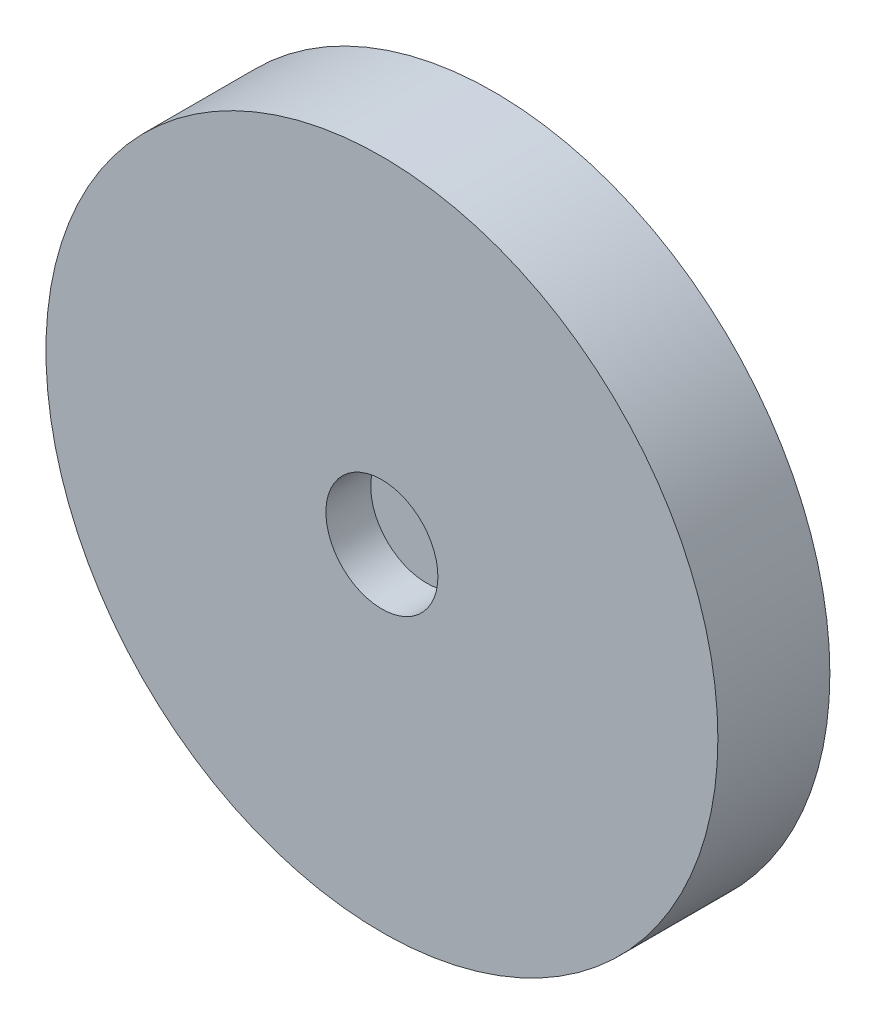
ISO-10303-21;
HEADER;
FILE_DESCRIPTION(('STEP AP214'),'2;1');
FILE_NAME('part.step','',(''),(''),'','','');
FILE_SCHEMA(('AUTOMOTIVE_DESIGN { 1 0 10303 214 1 1 1 1 }'));
ENDSEC;
DATA;
#1=APPLICATION_CONTEXT('core data for automotive mechanical design processes');
#2=APPLICATION_PROTOCOL_DEFINITION('international standard','automotive_design',2000,#1);
#3=PRODUCT_CONTEXT('',#1,'mechanical');
#4=PRODUCT('Part','Part','',(#3));
#5=PRODUCT_RELATED_PRODUCT_CATEGORY('part','',(#4));
#6=PRODUCT_DEFINITION_FORMATION('','',#4);
#7=PRODUCT_DEFINITION_CONTEXT('part definition',#1,'design');
#8=PRODUCT_DEFINITION('design','',#6,#7);
#9=PRODUCT_DEFINITION_SHAPE('','',#8);
#10=(LENGTH_UNIT() NAMED_UNIT(*) SI_UNIT(.MILLI.,.METRE.));
#11=(NAMED_UNIT(*) PLANE_ANGLE_UNIT() SI_UNIT($,.RADIAN.));
#12=(NAMED_UNIT(*) SI_UNIT($,.STERADIAN.) SOLID_ANGLE_UNIT());
#13=UNCERTAINTY_MEASURE_WITH_UNIT(LENGTH_MEASURE(1.E-05),#10,'distance_accuracy_value','');
#14=(GEOMETRIC_REPRESENTATION_CONTEXT(3) GLOBAL_UNCERTAINTY_ASSIGNED_CONTEXT((#13)) GLOBAL_UNIT_ASSIGNED_CONTEXT((#10,
#11,#12)) REPRESENTATION_CONTEXT('',''));
#15=CARTESIAN_POINT('',(0.,0.,0.));
#16=DIRECTION('',(0.,0.,1.));
#17=DIRECTION('',(1.,0.,0.));
#18=AXIS2_PLACEMENT_3D('',#15,#16,#17);
#19=CARTESIAN_POINT('',(0.,0.,5.));
#20=DIRECTION('',(0.,0.,-1.));
#21=DIRECTION('',(-1.,0.,0.));
#22=AXIS2_PLACEMENT_3D('',#19,#20,#21);
#23=CYLINDRICAL_SURFACE('',#22,15.);
#24=CARTESIAN_POINT('',(0.,0.,5.));
#25=DIRECTION('',(0.,0.,1.));
#26=DIRECTION('',(1.,0.,0.));
#27=AXIS2_PLACEMENT_3D('',#24,#25,#26);
#28=CIRCLE('',#27,15.);
#29=CARTESIAN_POINT('',(15.,0.,5.));
#30=VERTEX_POINT('',#29);
#31=EDGE_CURVE('E37',#30,#30,#28,.T.);
#32=ORIENTED_EDGE('',*,*,#31,.F.);
#33=EDGE_LOOP('',(#32));
#34=FACE_BOUND('',#33,.T.);
#35=CARTESIAN_POINT('',(0.,0.,0.));
#36=DIRECTION('',(0.,0.,1.));
#37=DIRECTION('',(1.,0.,0.));
#38=AXIS2_PLACEMENT_3D('',#35,#36,#37);
#39=CIRCLE('',#38,15.);
#40=CARTESIAN_POINT('',(15.,0.,0.));
#41=VERTEX_POINT('',#40);
#42=EDGE_CURVE('E41',#41,#41,#39,.T.);
#43=ORIENTED_EDGE('',*,*,#42,.T.);
#44=EDGE_LOOP('',(#43));
#45=FACE_BOUND('',#44,.T.);
#46=ADVANCED_FACE('F31',(#34,#45),#23,.T.);
#47=CARTESIAN_POINT('',(0.,0.,5.));
#48=DIRECTION('',(0.,0.,1.));
#49=DIRECTION('',(1.,0.,0.));
#50=AXIS2_PLACEMENT_3D('',#47,#48,#49);
#51=PLANE('',#50);
#52=CARTESIAN_POINT('',(0.,0.,5.));
#53=DIRECTION('',(0.,0.,1.));
#54=DIRECTION('',(1.,0.,0.));
#55=AXIS2_PLACEMENT_3D('',#52,#53,#54);
#56=CIRCLE('',#55,2.5);
#57=CARTESIAN_POINT('',(2.5,0.,5.));
#58=VERTEX_POINT('',#57);
#59=EDGE_CURVE('E51',#58,#58,#56,.T.);
#60=ORIENTED_EDGE('',*,*,#59,.F.);
#61=EDGE_LOOP('',(#60));
#62=FACE_BOUND('',#61,.T.);
#63=ORIENTED_EDGE('',*,*,#31,.T.);
#64=EDGE_LOOP('',(#63));
#65=FACE_BOUND('',#64,.T.);
#66=ADVANCED_FACE('F66',(#62,#65),#51,.T.);
#67=CARTESIAN_POINT('',(0.,0.,0.));
#68=DIRECTION('',(0.,0.,1.));
#69=DIRECTION('',(1.,0.,0.));
#70=AXIS2_PLACEMENT_3D('',#67,#68,#69);
#71=PLANE('',#70);
#72=CARTESIAN_POINT('',(0.,0.,0.));
#73=DIRECTION('',(0.,0.,1.));
#74=DIRECTION('',(1.,0.,0.));
#75=AXIS2_PLACEMENT_3D('',#72,#73,#74);
#76=CIRCLE('',#75,1.);
#77=CARTESIAN_POINT('',(1.,0.,0.));
#78=VERTEX_POINT('',#77);
#79=EDGE_CURVE('E10',#78,#78,#76,.F.);
#80=ORIENTED_EDGE('',*,*,#79,.F.);
#81=EDGE_LOOP('',(#80));
#82=FACE_BOUND('',#81,.T.);
#83=ORIENTED_EDGE('',*,*,#42,.F.);
#84=EDGE_LOOP('',(#83));
#85=FACE_BOUND('',#84,.T.);
#86=ADVANCED_FACE('F68',(#82,#85),#71,.F.);
#87=CARTESIAN_POINT('',(0.,0.,-3.));
#88=DIRECTION('',(0.,0.,1.));
#89=DIRECTION('',(1.,0.,0.));
#90=AXIS2_PLACEMENT_3D('',#87,#88,#89);
#91=CYLINDRICAL_SURFACE('',#90,1.);
#92=CARTESIAN_POINT('',(0.,0.,-3.));
#93=DIRECTION('',(0.,0.,-1.));
#94=DIRECTION('',(-1.,0.,0.));
#95=AXIS2_PLACEMENT_3D('',#92,#93,#94);
#96=CIRCLE('',#95,1.);
#97=CARTESIAN_POINT('',(-1.,0.,-3.));
#98=VERTEX_POINT('',#97);
#99=EDGE_CURVE('E46',#98,#98,#96,.T.);
#100=ORIENTED_EDGE('',*,*,#99,.F.);
#101=EDGE_LOOP('',(#100));
#102=FACE_BOUND('',#101,.T.);
#103=ORIENTED_EDGE('',*,*,#79,.T.);
#104=EDGE_LOOP('',(#103));
#105=FACE_BOUND('',#104,.T.);
#106=ADVANCED_FACE('F74',(#102,#105),#91,.T.);
#107=CARTESIAN_POINT('',(0.,0.,-3.));
#108=DIRECTION('',(0.,0.,-1.));
#109=DIRECTION('',(-1.,0.,0.));
#110=AXIS2_PLACEMENT_3D('',#107,#108,#109);
#111=PLANE('',#110);
#112=ORIENTED_EDGE('',*,*,#99,.T.);
#113=EDGE_LOOP('',(#112));
#114=FACE_BOUND('',#113,.T.);
#115=ADVANCED_FACE('F62',(#114),#111,.T.);
#116=CARTESIAN_POINT('',(0.,0.,3.));
#117=DIRECTION('',(0.,0.,1.));
#118=DIRECTION('',(1.,0.,0.));
#119=AXIS2_PLACEMENT_3D('',#116,#117,#118);
#120=CYLINDRICAL_SURFACE('',#119,2.5);
#121=CARTESIAN_POINT('',(0.,0.,3.));
#122=DIRECTION('',(0.,0.,1.));
#123=DIRECTION('',(1.,0.,0.));
#124=AXIS2_PLACEMENT_3D('',#121,#122,#123);
#125=CIRCLE('',#124,2.5);
#126=CARTESIAN_POINT('',(2.5,0.,3.));
#127=VERTEX_POINT('',#126);
#128=EDGE_CURVE('E50',#127,#127,#125,.T.);
#129=ORIENTED_EDGE('',*,*,#128,.F.);
#130=EDGE_LOOP('',(#129));
#131=FACE_BOUND('',#130,.T.);
#132=ORIENTED_EDGE('',*,*,#59,.T.);
#133=EDGE_LOOP('',(#132));
#134=FACE_BOUND('',#133,.T.);
#135=ADVANCED_FACE('F59',(#131,#134),#120,.F.);
#136=CARTESIAN_POINT('',(0.,0.,3.));
#137=DIRECTION('',(0.,0.,1.));
#138=DIRECTION('',(1.,0.,0.));
#139=AXIS2_PLACEMENT_3D('',#136,#137,#138);
#140=PLANE('',#139);
#141=ORIENTED_EDGE('',*,*,#128,.T.);
#142=EDGE_LOOP('',(#141));
#143=FACE_BOUND('',#142,.T.);
#144=ADVANCED_FACE('F57',(#143),#140,.T.);
#145=CLOSED_SHELL('',(#46,#66,#86,#106,#115,#135,#144));
#146=MANIFOLD_SOLID_BREP('B2',#145);
#147=ADVANCED_BREP_SHAPE_REPRESENTATION('',(#18,#146),#14);
#148=SHAPE_DEFINITION_REPRESENTATION(#9,#147);
ENDSEC;
END-ISO-10303-21;
